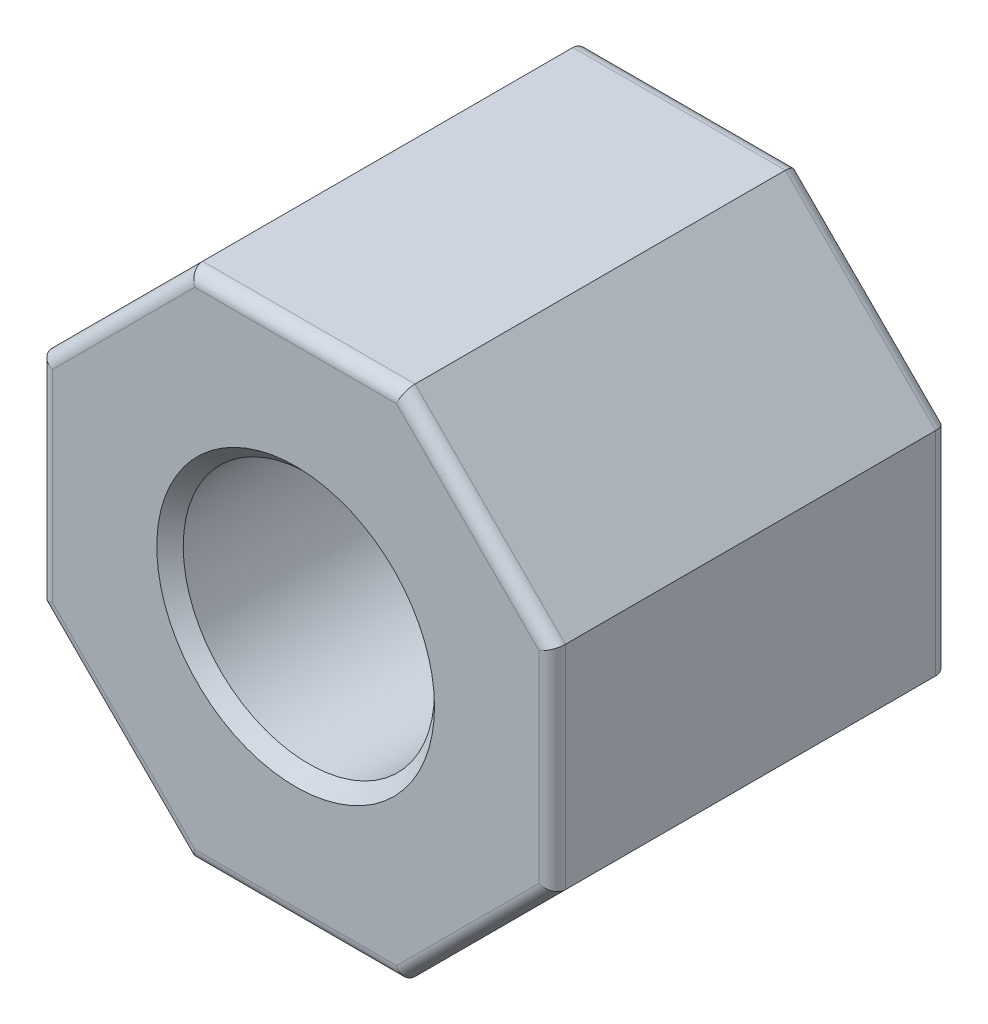
ISO-10303-21;
HEADER;
FILE_DESCRIPTION(('STEP AP214'),'2;1');
FILE_NAME('part.step','',(''),(''),'','','');
FILE_SCHEMA(('AUTOMOTIVE_DESIGN { 1 0 10303 214 1 1 1 1 }'));
ENDSEC;
DATA;
#1=APPLICATION_CONTEXT('core data for automotive mechanical design processes');
#2=APPLICATION_PROTOCOL_DEFINITION('international standard','automotive_design',2000,#1);
#3=PRODUCT_CONTEXT('',#1,'mechanical');
#4=PRODUCT('Part','Part','',(#3));
#5=PRODUCT_RELATED_PRODUCT_CATEGORY('part','',(#4));
#6=PRODUCT_DEFINITION_FORMATION('','',#4);
#7=PRODUCT_DEFINITION_CONTEXT('part definition',#1,'design');
#8=PRODUCT_DEFINITION('design','',#6,#7);
#9=PRODUCT_DEFINITION_SHAPE('','',#8);
#10=(LENGTH_UNIT() NAMED_UNIT(*) SI_UNIT(.MILLI.,.METRE.));
#11=(NAMED_UNIT(*) PLANE_ANGLE_UNIT() SI_UNIT($,.RADIAN.));
#12=(NAMED_UNIT(*) SI_UNIT($,.STERADIAN.) SOLID_ANGLE_UNIT());
#13=UNCERTAINTY_MEASURE_WITH_UNIT(LENGTH_MEASURE(1.E-05),#10,'distance_accuracy_value','');
#14=(GEOMETRIC_REPRESENTATION_CONTEXT(3) GLOBAL_UNCERTAINTY_ASSIGNED_CONTEXT((#13)) GLOBAL_UNIT_ASSIGNED_CONTEXT((#10,
#11,#12)) REPRESENTATION_CONTEXT('',''));
#15=CARTESIAN_POINT('',(0.,0.,0.));
#16=DIRECTION('',(0.,0.,1.));
#17=DIRECTION('',(1.,0.,0.));
#18=AXIS2_PLACEMENT_3D('',#15,#16,#17);
#19=CARTESIAN_POINT('',(0.,19.401470182737,30.));
#20=DIRECTION('',(0.,-1.,0.));
#21=DIRECTION('',(0.,0.,-1.));
#22=AXIS2_PLACEMENT_3D('',#19,#20,#21);
#23=PLANE('',#22);
#24=DIRECTION('',(0.,0.,-1.));
#25=VECTOR('',#24,1.);
#26=CARTESIAN_POINT('',(-8.03635207966684,19.401470182737,30.));
#27=LINE('',#26,#25);
#28=CARTESIAN_POINT('',(-8.03635207966684,19.401470182737,29.));
#29=VERTEX_POINT('',#28);
#30=CARTESIAN_POINT('',(-8.03635207966684,19.401470182737,1.));
#31=VERTEX_POINT('',#30);
#32=EDGE_CURVE('E396',#29,#31,#27,.T.);
#33=ORIENTED_EDGE('',*,*,#32,.F.);
#34=DIRECTION('',(-1.,0.,0.));
#35=VECTOR('',#34,1.);
#36=CARTESIAN_POINT('',(8.03635207966683,19.401470182737,29.));
#37=LINE('',#36,#35);
#38=CARTESIAN_POINT('',(8.03635207966683,19.401470182737,29.));
#39=VERTEX_POINT('',#38);
#40=EDGE_CURVE('E171',#29,#39,#37,.F.);
#41=ORIENTED_EDGE('',*,*,#40,.T.);
#42=DIRECTION('',(0.,0.,-1.));
#43=VECTOR('',#42,1.);
#44=CARTESIAN_POINT('',(8.03635207966683,19.401470182737,30.));
#45=LINE('',#44,#43);
#46=CARTESIAN_POINT('',(8.03635207966683,19.401470182737,1.));
#47=VERTEX_POINT('',#46);
#48=EDGE_CURVE('E175',#39,#47,#45,.T.);
#49=ORIENTED_EDGE('',*,*,#48,.T.);
#50=DIRECTION('',(-1.,0.,0.));
#51=VECTOR('',#50,1.);
#52=CARTESIAN_POINT('',(0.,19.401470182737,1.));
#53=LINE('',#52,#51);
#54=EDGE_CURVE('E247',#47,#31,#53,.T.);
#55=ORIENTED_EDGE('',*,*,#54,.T.);
#56=EDGE_LOOP('',(#33,#41,#49,#55));
#57=FACE_BOUND('',#56,.T.);
#58=ADVANCED_FACE('F42',(#57),#23,.F.);
#59=CARTESIAN_POINT('',(-13.7189111312019,13.718911131202,30.));
#60=DIRECTION('',(0.707106781186546,-0.707106781186549,0.));
#61=DIRECTION('',(0.707106781186549,0.707106781186546,0.));
#62=AXIS2_PLACEMENT_3D('',#59,#60,#61);
#63=PLANE('',#62);
#64=DIRECTION('',(0.,0.,-1.));
#65=VECTOR('',#64,1.);
#66=CARTESIAN_POINT('',(-19.401470182737,8.03635207966691,30.));
#67=LINE('',#66,#65);
#68=CARTESIAN_POINT('',(-19.401470182737,8.03635207966691,29.));
#69=VERTEX_POINT('',#68);
#70=CARTESIAN_POINT('',(-19.401470182737,8.03635207966691,1.));
#71=VERTEX_POINT('',#70);
#72=EDGE_CURVE('E392',#69,#71,#67,.T.);
#73=ORIENTED_EDGE('',*,*,#72,.F.);
#74=DIRECTION('',(-0.707106781186549,-0.707106781186546,0.));
#75=VECTOR('',#74,1.);
#76=CARTESIAN_POINT('',(-8.03635207966683,19.401470182737,29.));
#77=LINE('',#76,#75);
#78=EDGE_CURVE('E255',#69,#29,#77,.F.);
#79=ORIENTED_EDGE('',*,*,#78,.T.);
#80=ORIENTED_EDGE('',*,*,#32,.T.);
#81=DIRECTION('',(-0.707106781186549,-0.707106781186546,0.));
#82=VECTOR('',#81,1.);
#83=CARTESIAN_POINT('',(-13.7189111312019,13.718911131202,1.));
#84=LINE('',#83,#82);
#85=EDGE_CURVE('E252',#31,#71,#84,.T.);
#86=ORIENTED_EDGE('',*,*,#85,.T.);
#87=EDGE_LOOP('',(#73,#79,#80,#86));
#88=FACE_BOUND('',#87,.T.);
#89=ADVANCED_FACE('F433',(#88),#63,.F.);
#90=CARTESIAN_POINT('',(-19.401470182737,0.,30.));
#91=DIRECTION('',(1.,0.,0.));
#92=DIRECTION('',(0.,0.,-1.));
#93=AXIS2_PLACEMENT_3D('',#90,#91,#92);
#94=PLANE('',#93);
#95=DIRECTION('',(0.,0.,-1.));
#96=VECTOR('',#95,1.);
#97=CARTESIAN_POINT('',(-19.401470182737,-8.03635207966691,30.));
#98=LINE('',#97,#96);
#99=CARTESIAN_POINT('',(-19.401470182737,-8.03635207966691,29.));
#100=VERTEX_POINT('',#99);
#101=CARTESIAN_POINT('',(-19.401470182737,-8.03635207966691,1.));
#102=VERTEX_POINT('',#101);
#103=EDGE_CURVE('E383',#100,#102,#98,.T.);
#104=ORIENTED_EDGE('',*,*,#103,.F.);
#105=DIRECTION('',(0.,-1.,0.));
#106=VECTOR('',#105,1.);
#107=CARTESIAN_POINT('',(-19.401470182737,8.03635207966691,29.));
#108=LINE('',#107,#106);
#109=EDGE_CURVE('E225',#100,#69,#108,.F.);
#110=ORIENTED_EDGE('',*,*,#109,.T.);
#111=ORIENTED_EDGE('',*,*,#72,.T.);
#112=DIRECTION('',(0.,-1.,0.));
#113=VECTOR('',#112,1.);
#114=CARTESIAN_POINT('',(-19.401470182737,0.,1.));
#115=LINE('',#114,#113);
#116=EDGE_CURVE('E222',#71,#102,#115,.T.);
#117=ORIENTED_EDGE('',*,*,#116,.T.);
#118=EDGE_LOOP('',(#104,#110,#111,#117));
#119=FACE_BOUND('',#118,.T.);
#120=ADVANCED_FACE('F439',(#119),#94,.F.);
#121=CARTESIAN_POINT('',(-13.718911131202,-13.718911131202,30.));
#122=DIRECTION('',(0.707106781186549,0.707106781186547,0.));
#123=DIRECTION('',(-0.707106781186547,0.707106781186549,0.));
#124=AXIS2_PLACEMENT_3D('',#121,#122,#123);
#125=PLANE('',#124);
#126=DIRECTION('',(0.,0.,-1.));
#127=VECTOR('',#126,1.);
#128=CARTESIAN_POINT('',(-8.03635207966687,-19.4014701827371,30.));
#129=LINE('',#128,#127);
#130=CARTESIAN_POINT('',(-8.03635207966687,-19.4014701827371,29.));
#131=VERTEX_POINT('',#130);
#132=CARTESIAN_POINT('',(-8.03635207966687,-19.4014701827371,1.));
#133=VERTEX_POINT('',#132);
#134=EDGE_CURVE('E372',#131,#133,#129,.T.);
#135=ORIENTED_EDGE('',*,*,#134,.F.);
#136=DIRECTION('',(0.707106781186547,-0.707106781186549,0.));
#137=VECTOR('',#136,1.);
#138=CARTESIAN_POINT('',(-19.401470182737,-8.03635207966691,29.));
#139=LINE('',#138,#137);
#140=EDGE_CURVE('E219',#131,#100,#139,.F.);
#141=ORIENTED_EDGE('',*,*,#140,.T.);
#142=ORIENTED_EDGE('',*,*,#103,.T.);
#143=DIRECTION('',(0.707106781186547,-0.707106781186549,0.));
#144=VECTOR('',#143,1.);
#145=CARTESIAN_POINT('',(-13.718911131202,-13.718911131202,1.));
#146=LINE('',#145,#144);
#147=EDGE_CURVE('E216',#102,#133,#146,.T.);
#148=ORIENTED_EDGE('',*,*,#147,.T.);
#149=EDGE_LOOP('',(#135,#141,#142,#148));
#150=FACE_BOUND('',#149,.T.);
#151=ADVANCED_FACE('F584',(#150),#125,.F.);
#152=CARTESIAN_POINT('',(0.,-19.4014701827371,30.));
#153=DIRECTION('',(0.,1.,0.));
#154=DIRECTION('',(-1.,0.,0.));
#155=AXIS2_PLACEMENT_3D('',#152,#153,#154);
#156=PLANE('',#155);
#157=DIRECTION('',(0.,0.,-1.));
#158=VECTOR('',#157,1.);
#159=CARTESIAN_POINT('',(8.03635207966695,-19.4014701827371,30.));
#160=LINE('',#159,#158);
#161=CARTESIAN_POINT('',(8.03635207966695,-19.4014701827371,29.));
#162=VERTEX_POINT('',#161);
#163=CARTESIAN_POINT('',(8.03635207966695,-19.4014701827371,1.));
#164=VERTEX_POINT('',#163);
#165=EDGE_CURVE('E369',#162,#164,#160,.T.);
#166=ORIENTED_EDGE('',*,*,#165,.F.);
#167=DIRECTION('',(1.,0.,0.));
#168=VECTOR('',#167,1.);
#169=CARTESIAN_POINT('',(-8.03635207966687,-19.4014701827371,29.));
#170=LINE('',#169,#168);
#171=EDGE_CURVE('E212',#162,#131,#170,.F.);
#172=ORIENTED_EDGE('',*,*,#171,.T.);
#173=ORIENTED_EDGE('',*,*,#134,.T.);
#174=DIRECTION('',(1.,0.,0.));
#175=VECTOR('',#174,1.);
#176=CARTESIAN_POINT('',(0.,-19.4014701827371,1.));
#177=LINE('',#176,#175);
#178=EDGE_CURVE('E209',#133,#164,#177,.T.);
#179=ORIENTED_EDGE('',*,*,#178,.T.);
#180=EDGE_LOOP('',(#166,#172,#173,#179));
#181=FACE_BOUND('',#180,.T.);
#182=ADVANCED_FACE('F368',(#181),#156,.F.);
#183=CARTESIAN_POINT('',(13.718911131202,-13.718911131202,30.));
#184=DIRECTION('',(-0.707106781186549,0.707106781186546,0.));
#185=DIRECTION('',(-0.707106781186546,-0.707106781186549,0.));
#186=AXIS2_PLACEMENT_3D('',#183,#184,#185);
#187=PLANE('',#186);
#188=DIRECTION('',(0.,0.,-1.));
#189=VECTOR('',#188,1.);
#190=CARTESIAN_POINT('',(19.4014701827371,-8.03635207966686,30.));
#191=LINE('',#190,#189);
#192=CARTESIAN_POINT('',(19.4014701827371,-8.03635207966686,29.));
#193=VERTEX_POINT('',#192);
#194=CARTESIAN_POINT('',(19.4014701827371,-8.03635207966686,1.));
#195=VERTEX_POINT('',#194);
#196=EDGE_CURVE('E379',#193,#195,#191,.T.);
#197=ORIENTED_EDGE('',*,*,#196,.F.);
#198=DIRECTION('',(0.707106781186546,0.707106781186549,0.));
#199=VECTOR('',#198,1.);
#200=CARTESIAN_POINT('',(8.03635207966695,-19.4014701827371,29.));
#201=LINE('',#200,#199);
#202=EDGE_CURVE('E231',#193,#162,#201,.F.);
#203=ORIENTED_EDGE('',*,*,#202,.T.);
#204=ORIENTED_EDGE('',*,*,#165,.T.);
#205=DIRECTION('',(0.707106781186546,0.707106781186549,0.));
#206=VECTOR('',#205,1.);
#207=CARTESIAN_POINT('',(13.718911131202,-13.718911131202,1.));
#208=LINE('',#207,#206);
#209=EDGE_CURVE('E228',#164,#195,#208,.T.);
#210=ORIENTED_EDGE('',*,*,#209,.T.);
#211=EDGE_LOOP('',(#197,#203,#204,#210));
#212=FACE_BOUND('',#211,.T.);
#213=ADVANCED_FACE('F375',(#212),#187,.F.);
#214=CARTESIAN_POINT('',(19.4014701827371,0.,30.));
#215=DIRECTION('',(-1.,0.,0.));
#216=DIRECTION('',(0.,-1.,0.));
#217=AXIS2_PLACEMENT_3D('',#214,#215,#216);
#218=PLANE('',#217);
#219=DIRECTION('',(0.,0.,-1.));
#220=VECTOR('',#219,1.);
#221=CARTESIAN_POINT('',(19.4014701827371,8.03635207966695,30.));
#222=LINE('',#221,#220);
#223=CARTESIAN_POINT('',(19.4014701827371,8.03635207966695,29.));
#224=VERTEX_POINT('',#223);
#225=CARTESIAN_POINT('',(19.4014701827371,8.03635207966695,1.));
#226=VERTEX_POINT('',#225);
#227=EDGE_CURVE('E385',#224,#226,#222,.T.);
#228=ORIENTED_EDGE('',*,*,#227,.F.);
#229=DIRECTION('',(0.,1.,0.));
#230=VECTOR('',#229,1.);
#231=CARTESIAN_POINT('',(19.4014701827371,-8.03635207966686,29.));
#232=LINE('',#231,#230);
#233=EDGE_CURVE('E238',#224,#193,#232,.F.);
#234=ORIENTED_EDGE('',*,*,#233,.T.);
#235=ORIENTED_EDGE('',*,*,#196,.T.);
#236=DIRECTION('',(0.,1.,0.));
#237=VECTOR('',#236,1.);
#238=CARTESIAN_POINT('',(19.4014701827371,0.,1.));
#239=LINE('',#238,#237);
#240=EDGE_CURVE('E234',#195,#226,#239,.T.);
#241=ORIENTED_EDGE('',*,*,#240,.T.);
#242=EDGE_LOOP('',(#228,#234,#235,#241));
#243=FACE_BOUND('',#242,.T.);
#244=ADVANCED_FACE('F428',(#243),#218,.F.);
#245=CARTESIAN_POINT('',(13.7189111312019,13.7189111312021,30.));
#246=DIRECTION('',(-0.707106781186543,-0.707106781186552,0.));
#247=DIRECTION('',(0.707106781186552,-0.707106781186543,0.));
#248=AXIS2_PLACEMENT_3D('',#245,#246,#247);
#249=PLANE('',#248);
#250=ORIENTED_EDGE('',*,*,#48,.F.);
#251=DIRECTION('',(-0.707106781186552,0.707106781186543,0.));
#252=VECTOR('',#251,1.);
#253=CARTESIAN_POINT('',(19.4014701827371,8.03635207966695,29.));
#254=LINE('',#253,#252);
#255=EDGE_CURVE('E244',#39,#224,#254,.F.);
#256=ORIENTED_EDGE('',*,*,#255,.T.);
#257=ORIENTED_EDGE('',*,*,#227,.T.);
#258=DIRECTION('',(-0.707106781186552,0.707106781186543,0.));
#259=VECTOR('',#258,1.);
#260=CARTESIAN_POINT('',(13.7189111312019,13.7189111312021,1.));
#261=LINE('',#260,#259);
#262=EDGE_CURVE('E241',#226,#47,#261,.T.);
#263=ORIENTED_EDGE('',*,*,#262,.T.);
#264=EDGE_LOOP('',(#250,#256,#257,#263));
#265=FACE_BOUND('',#264,.T.);
#266=ADVANCED_FACE('F421',(#265),#249,.F.);
#267=CARTESIAN_POINT('',(0.,0.,30.));
#268=DIRECTION('',(0.,0.,1.));
#269=DIRECTION('',(1.,0.,0.));
#270=AXIS2_PLACEMENT_3D('',#267,#268,#269);
#271=PLANE('',#270);
#272=DIRECTION('',(0.707106781186547,-0.707106781186549,0.));
#273=VECTOR('',#272,1.);
#274=CARTESIAN_POINT('',(-7.32924529848032,-18.6943634015505,30.));
#275=LINE('',#274,#273);
#276=CARTESIAN_POINT('',(-18.401470182737,-7.62213851729382,30.));
#277=VERTEX_POINT('',#276);
#278=CARTESIAN_POINT('',(-7.62213851729378,-18.4014701827371,30.));
#279=VERTEX_POINT('',#278);
#280=EDGE_CURVE('E202',#277,#279,#275,.T.);
#281=ORIENTED_EDGE('',*,*,#280,.T.);
#282=DIRECTION('',(1.,0.,0.));
#283=VECTOR('',#282,1.);
#284=CARTESIAN_POINT('',(8.03635207966695,-18.4014701827371,30.));
#285=LINE('',#284,#283);
#286=CARTESIAN_POINT('',(7.62213851729385,-18.4014701827371,30.));
#287=VERTEX_POINT('',#286);
#288=EDGE_CURVE('E205',#279,#287,#285,.T.);
#289=ORIENTED_EDGE('',*,*,#288,.T.);
#290=DIRECTION('',(0.707106781186546,0.707106781186549,0.));
#291=VECTOR('',#290,1.);
#292=CARTESIAN_POINT('',(18.6943634015506,-7.32924529848032,30.));
#293=LINE('',#292,#291);
#294=CARTESIAN_POINT('',(18.4014701827371,-7.62213851729376,30.));
#295=VERTEX_POINT('',#294);
#296=EDGE_CURVE('E196',#287,#295,#293,.T.);
#297=ORIENTED_EDGE('',*,*,#296,.T.);
#298=DIRECTION('',(0.,1.,0.));
#299=VECTOR('',#298,1.);
#300=CARTESIAN_POINT('',(18.4014701827371,8.03635207966695,30.));
#301=LINE('',#300,#299);
#302=CARTESIAN_POINT('',(18.4014701827371,7.62213851729384,30.));
#303=VERTEX_POINT('',#302);
#304=EDGE_CURVE('E193',#295,#303,#301,.T.);
#305=ORIENTED_EDGE('',*,*,#304,.T.);
#306=DIRECTION('',(-0.707106781186552,0.707106781186543,0.));
#307=VECTOR('',#306,1.);
#308=CARTESIAN_POINT('',(7.32924529848028,18.6943634015505,30.));
#309=LINE('',#308,#307);
#310=CARTESIAN_POINT('',(7.62213851729374,18.401470182737,30.));
#311=VERTEX_POINT('',#310);
#312=EDGE_CURVE('E161',#303,#311,#309,.T.);
#313=ORIENTED_EDGE('',*,*,#312,.T.);
#314=DIRECTION('',(-1.,0.,0.));
#315=VECTOR('',#314,1.);
#316=CARTESIAN_POINT('',(-8.03635207966684,18.401470182737,30.));
#317=LINE('',#316,#315);
#318=CARTESIAN_POINT('',(-7.62213851729374,18.401470182737,30.));
#319=VERTEX_POINT('',#318);
#320=EDGE_CURVE('E153',#311,#319,#317,.T.);
#321=ORIENTED_EDGE('',*,*,#320,.T.);
#322=DIRECTION('',(-0.707106781186549,-0.707106781186546,0.));
#323=VECTOR('',#322,1.);
#324=CARTESIAN_POINT('',(-18.6943634015505,7.32924529848035,30.));
#325=LINE('',#324,#323);
#326=CARTESIAN_POINT('',(-18.401470182737,7.62213851729381,30.));
#327=VERTEX_POINT('',#326);
#328=EDGE_CURVE('E158',#319,#327,#325,.T.);
#329=ORIENTED_EDGE('',*,*,#328,.T.);
#330=DIRECTION('',(0.,-1.,0.));
#331=VECTOR('',#330,1.);
#332=CARTESIAN_POINT('',(-18.401470182737,-8.03635207966691,30.));
#333=LINE('',#332,#331);
#334=EDGE_CURVE('E199',#327,#277,#333,.T.);
#335=ORIENTED_EDGE('',*,*,#334,.T.);
#336=EDGE_LOOP('',(#281,#289,#297,#305,#313,#321,#329,#335));
#337=FACE_BOUND('',#336,.T.);
#338=CARTESIAN_POINT('',(0.,0.,30.));
#339=DIRECTION('',(0.,0.,1.));
#340=DIRECTION('',(1.,0.,0.));
#341=AXIS2_PLACEMENT_3D('',#338,#339,#340);
#342=CIRCLE('',#341,10.5);
#343=CARTESIAN_POINT('',(10.5,0.,30.));
#344=VERTEX_POINT('',#343);
#345=EDGE_CURVE('E400',#344,#344,#342,.F.);
#346=ORIENTED_EDGE('',*,*,#345,.T.);
#347=EDGE_LOOP('',(#346));
#348=FACE_BOUND('',#347,.T.);
#349=ADVANCED_FACE('F155',(#337,#348),#271,.T.);
#350=CARTESIAN_POINT('',(0.,0.,0.));
#351=DIRECTION('',(0.,0.,1.));
#352=DIRECTION('',(1.,0.,0.));
#353=AXIS2_PLACEMENT_3D('',#350,#351,#352);
#354=PLANE('',#353);
#355=DIRECTION('',(0.,1.,0.));
#356=VECTOR('',#355,1.);
#357=CARTESIAN_POINT('',(18.4014701827371,0.,0.));
#358=LINE('',#357,#356);
#359=CARTESIAN_POINT('',(18.4014701827371,7.62213851729384,0.));
#360=VERTEX_POINT('',#359);
#361=CARTESIAN_POINT('',(18.4014701827371,-7.62213851729376,0.));
#362=VERTEX_POINT('',#361);
#363=EDGE_CURVE('E264',#360,#362,#358,.F.);
#364=ORIENTED_EDGE('',*,*,#363,.T.);
#365=DIRECTION('',(0.707106781186546,0.707106781186549,0.));
#366=VECTOR('',#365,1.);
#367=CARTESIAN_POINT('',(13.0118043500155,-13.0118043500154,0.));
#368=LINE('',#367,#366);
#369=CARTESIAN_POINT('',(7.62213851729385,-18.4014701827371,0.));
#370=VERTEX_POINT('',#369);
#371=EDGE_CURVE('E11',#362,#370,#368,.F.);
#372=ORIENTED_EDGE('',*,*,#371,.T.);
#373=DIRECTION('',(1.,0.,0.));
#374=VECTOR('',#373,1.);
#375=CARTESIAN_POINT('',(0.,-18.4014701827371,0.));
#376=LINE('',#375,#374);
#377=CARTESIAN_POINT('',(-7.62213851729377,-18.4014701827371,0.));
#378=VERTEX_POINT('',#377);
#379=EDGE_CURVE('E52',#370,#378,#376,.F.);
#380=ORIENTED_EDGE('',*,*,#379,.T.);
#381=DIRECTION('',(0.707106781186547,-0.707106781186549,0.));
#382=VECTOR('',#381,1.);
#383=CARTESIAN_POINT('',(-13.0118043500154,-13.0118043500154,0.));
#384=LINE('',#383,#382);
#385=CARTESIAN_POINT('',(-18.401470182737,-7.62213851729382,0.));
#386=VERTEX_POINT('',#385);
#387=EDGE_CURVE('E273',#378,#386,#384,.F.);
#388=ORIENTED_EDGE('',*,*,#387,.T.);
#389=DIRECTION('',(0.,-1.,0.));
#390=VECTOR('',#389,1.);
#391=CARTESIAN_POINT('',(-18.401470182737,0.,0.));
#392=LINE('',#391,#390);
#393=CARTESIAN_POINT('',(-18.401470182737,7.62213851729381,0.));
#394=VERTEX_POINT('',#393);
#395=EDGE_CURVE('E270',#386,#394,#392,.F.);
#396=ORIENTED_EDGE('',*,*,#395,.T.);
#397=DIRECTION('',(-0.707106781186549,-0.707106781186546,0.));
#398=VECTOR('',#397,1.);
#399=CARTESIAN_POINT('',(-13.0118043500154,13.0118043500154,0.));
#400=LINE('',#399,#398);
#401=CARTESIAN_POINT('',(-7.62213851729374,18.401470182737,0.));
#402=VERTEX_POINT('',#401);
#403=EDGE_CURVE('E267',#394,#402,#400,.F.);
#404=ORIENTED_EDGE('',*,*,#403,.T.);
#405=DIRECTION('',(-1.,0.,0.));
#406=VECTOR('',#405,1.);
#407=CARTESIAN_POINT('',(0.,18.401470182737,0.));
#408=LINE('',#407,#406);
#409=CARTESIAN_POINT('',(7.62213851729374,18.401470182737,0.));
#410=VERTEX_POINT('',#409);
#411=EDGE_CURVE('E261',#402,#410,#408,.F.);
#412=ORIENTED_EDGE('',*,*,#411,.T.);
#413=DIRECTION('',(-0.707106781186552,0.707106781186543,0.));
#414=VECTOR('',#413,1.);
#415=CARTESIAN_POINT('',(13.0118043500153,13.0118043500155,0.));
#416=LINE('',#415,#414);
#417=EDGE_CURVE('E258',#410,#360,#416,.F.);
#418=ORIENTED_EDGE('',*,*,#417,.T.);
#419=EDGE_LOOP('',(#364,#372,#380,#388,#396,#404,#412,#418));
#420=FACE_BOUND('',#419,.T.);
#421=CARTESIAN_POINT('',(0.,0.,0.));
#422=DIRECTION('',(0.,0.,1.));
#423=DIRECTION('',(1.,0.,0.));
#424=AXIS2_PLACEMENT_3D('',#421,#422,#423);
#425=CIRCLE('',#424,10.5);
#426=CARTESIAN_POINT('',(10.5,0.,0.));
#427=VERTEX_POINT('',#426);
#428=EDGE_CURVE('E183',#427,#427,#425,.T.);
#429=ORIENTED_EDGE('',*,*,#428,.T.);
#430=EDGE_LOOP('',(#429));
#431=FACE_BOUND('',#430,.T.);
#432=ADVANCED_FACE('F338',(#420,#431),#354,.F.);
#433=CARTESIAN_POINT('',(0.,0.,30.));
#434=DIRECTION('',(0.,0.,-1.));
#435=DIRECTION('',(-1.,0.,0.));
#436=AXIS2_PLACEMENT_3D('',#433,#434,#435);
#437=CYLINDRICAL_SURFACE('',#436,9.5);
#438=CARTESIAN_POINT('',(0.,0.,29.));
#439=DIRECTION('',(0.,0.,1.));
#440=DIRECTION('',(1.,0.,0.));
#441=AXIS2_PLACEMENT_3D('',#438,#439,#440);
#442=CIRCLE('',#441,9.5);
#443=CARTESIAN_POINT('',(9.5,0.,29.));
#444=VERTEX_POINT('',#443);
#445=EDGE_CURVE('E187',#444,#444,#442,.T.);
#446=ORIENTED_EDGE('',*,*,#445,.T.);
#447=EDGE_LOOP('',(#446));
#448=FACE_BOUND('',#447,.T.);
#449=CARTESIAN_POINT('',(0.,0.,0.999999999999994));
#450=DIRECTION('',(0.,0.,1.));
#451=DIRECTION('',(1.,0.,0.));
#452=AXIS2_PLACEMENT_3D('',#449,#450,#451);
#453=CIRCLE('',#452,9.5);
#454=CARTESIAN_POINT('',(9.5,0.,0.999999999999994));
#455=VERTEX_POINT('',#454);
#456=EDGE_CURVE('E404',#455,#455,#453,.F.);
#457=ORIENTED_EDGE('',*,*,#456,.T.);
#458=EDGE_LOOP('',(#457));
#459=FACE_BOUND('',#458,.T.);
#460=ADVANCED_FACE('F411',(#448,#459),#437,.F.);
#461=CARTESIAN_POINT('',(0.,0.,30.));
#462=DIRECTION('',(0.,0.,1.));
#463=DIRECTION('',(1.,0.,0.));
#464=AXIS2_PLACEMENT_3D('',#461,#462,#463);
#465=CONICAL_SURFACE('',#464,10.5,0.785398163397447);
#466=ORIENTED_EDGE('',*,*,#445,.F.);
#467=EDGE_LOOP('',(#466));
#468=FACE_BOUND('',#467,.T.);
#469=ORIENTED_EDGE('',*,*,#345,.F.);
#470=EDGE_LOOP('',(#469));
#471=FACE_BOUND('',#470,.T.);
#472=ADVANCED_FACE('F414',(#468,#471),#465,.F.);
#473=CARTESIAN_POINT('',(0.,0.,0.999999999999994));
#474=DIRECTION('',(0.,0.,-1.));
#475=DIRECTION('',(-1.,0.,0.));
#476=AXIS2_PLACEMENT_3D('',#473,#474,#475);
#477=CONICAL_SURFACE('',#476,9.5,0.785398163397453);
#478=ORIENTED_EDGE('',*,*,#428,.F.);
#479=EDGE_LOOP('',(#478));
#480=FACE_BOUND('',#479,.T.);
#481=ORIENTED_EDGE('',*,*,#456,.F.);
#482=EDGE_LOOP('',(#481));
#483=FACE_BOUND('',#482,.T.);
#484=ADVANCED_FACE('F417',(#480,#483),#477,.F.);
#485=CARTESIAN_POINT('',(0.,18.401470182737,29.));
#486=DIRECTION('',(1.,0.,0.));
#487=DIRECTION('',(0.,0.,-1.));
#488=AXIS2_PLACEMENT_3D('',#485,#486,#487);
#489=CYLINDRICAL_SURFACE('',#488,1.);
#490=CARTESIAN_POINT('',(7.62213851729373,18.401470182737,29.));
#491=DIRECTION('',(0.923879532511288,-0.382683432365087,0.));
#492=DIRECTION('',(0.382683432365087,0.923879532511288,0.));
#493=AXIS2_PLACEMENT_3D('',#490,#491,#492);
#494=ELLIPSE('',#493,1.08239220029239,1.);
#495=EDGE_CURVE('E176',#39,#311,#494,.T.);
#496=ORIENTED_EDGE('',*,*,#495,.F.);
#497=ORIENTED_EDGE('',*,*,#40,.F.);
#498=CARTESIAN_POINT('',(-7.62213851729374,18.401470182737,29.));
#499=DIRECTION('',(0.923879532511287,0.382683432365089,0.));
#500=DIRECTION('',(-0.382683432365089,0.923879532511287,0.));
#501=AXIS2_PLACEMENT_3D('',#498,#499,#500);
#502=ELLIPSE('',#501,1.08239220029239,1.);
#503=EDGE_CURVE('E169',#319,#29,#502,.F.);
#504=ORIENTED_EDGE('',*,*,#503,.F.);
#505=ORIENTED_EDGE('',*,*,#320,.F.);
#506=EDGE_LOOP('',(#496,#497,#504,#505));
#507=FACE_BOUND('',#506,.T.);
#508=ADVANCED_FACE('F170',(#507),#489,.T.);
#509=CARTESIAN_POINT('',(-13.0118043500154,13.0118043500154,29.));
#510=DIRECTION('',(0.707106781186549,0.707106781186546,0.));
#511=DIRECTION('',(-0.707106781186546,0.707106781186549,0.));
#512=AXIS2_PLACEMENT_3D('',#509,#510,#511);
#513=CYLINDRICAL_SURFACE('',#512,1.);
#514=ORIENTED_EDGE('',*,*,#503,.T.);
#515=ORIENTED_EDGE('',*,*,#78,.F.);
#516=CARTESIAN_POINT('',(-18.401470182737,7.62213851729381,29.));
#517=DIRECTION('',(0.382683432365091,0.923879532511287,0.));
#518=DIRECTION('',(0.923879532511286,-0.38268343236509,0.));
#519=AXIS2_PLACEMENT_3D('',#516,#517,#518);
#520=ELLIPSE('',#519,1.08239220029239,1.);
#521=EDGE_CURVE('E180',#327,#69,#520,.F.);
#522=ORIENTED_EDGE('',*,*,#521,.F.);
#523=ORIENTED_EDGE('',*,*,#328,.F.);
#524=EDGE_LOOP('',(#514,#515,#522,#523));
#525=FACE_BOUND('',#524,.T.);
#526=ADVANCED_FACE('F178',(#525),#513,.T.);
#527=CARTESIAN_POINT('',(13.0118043500153,13.0118043500155,29.));
#528=DIRECTION('',(0.707106781186552,-0.707106781186543,0.));
#529=DIRECTION('',(0.707106781186543,0.707106781186552,0.));
#530=AXIS2_PLACEMENT_3D('',#527,#528,#529);
#531=CYLINDRICAL_SURFACE('',#530,1.);
#532=ORIENTED_EDGE('',*,*,#495,.T.);
#533=ORIENTED_EDGE('',*,*,#312,.F.);
#534=CARTESIAN_POINT('',(18.4014701827371,7.62213851729384,29.));
#535=DIRECTION('',(0.382683432365094,-0.923879532511285,0.));
#536=DIRECTION('',(0.923879532511285,0.382683432365094,0.));
#537=AXIS2_PLACEMENT_3D('',#534,#535,#536);
#538=ELLIPSE('',#537,1.08239220029239,1.);
#539=EDGE_CURVE('E292',#224,#303,#538,.T.);
#540=ORIENTED_EDGE('',*,*,#539,.F.);
#541=ORIENTED_EDGE('',*,*,#255,.F.);
#542=EDGE_LOOP('',(#532,#533,#540,#541));
#543=FACE_BOUND('',#542,.T.);
#544=ADVANCED_FACE('F473',(#543),#531,.T.);
#545=CARTESIAN_POINT('',(-18.401470182737,0.,29.));
#546=DIRECTION('',(0.,1.,0.));
#547=DIRECTION('',(0.,0.,1.));
#548=AXIS2_PLACEMENT_3D('',#545,#546,#547);
#549=CYLINDRICAL_SURFACE('',#548,1.);
#550=ORIENTED_EDGE('',*,*,#521,.T.);
#551=ORIENTED_EDGE('',*,*,#109,.F.);
#552=CARTESIAN_POINT('',(-18.401470182737,-7.62213851729382,29.));
#553=DIRECTION('',(-0.382683432365089,0.923879532511287,0.));
#554=DIRECTION('',(0.923879532511287,0.382683432365089,0.));
#555=AXIS2_PLACEMENT_3D('',#552,#553,#554);
#556=ELLIPSE('',#555,1.08239220029239,1.);
#557=EDGE_CURVE('E288',#277,#100,#556,.F.);
#558=ORIENTED_EDGE('',*,*,#557,.F.);
#559=ORIENTED_EDGE('',*,*,#334,.F.);
#560=EDGE_LOOP('',(#550,#551,#558,#559));
#561=FACE_BOUND('',#560,.T.);
#562=ADVANCED_FACE('F469',(#561),#549,.T.);
#563=CARTESIAN_POINT('',(18.4014701827371,0.,29.));
#564=DIRECTION('',(0.,-1.,0.));
#565=DIRECTION('',(1.,0.,0.));
#566=AXIS2_PLACEMENT_3D('',#563,#564,#565);
#567=CYLINDRICAL_SURFACE('',#566,1.);
#568=ORIENTED_EDGE('',*,*,#539,.T.);
#569=ORIENTED_EDGE('',*,*,#304,.F.);
#570=CARTESIAN_POINT('',(18.4014701827371,-7.62213851729377,29.));
#571=DIRECTION('',(-0.382683432365088,-0.923879532511288,0.));
#572=DIRECTION('',(0.923879532511288,-0.382683432365088,0.));
#573=AXIS2_PLACEMENT_3D('',#570,#571,#572);
#574=ELLIPSE('',#573,1.08239220029239,1.);
#575=EDGE_CURVE('E284',#193,#295,#574,.T.);
#576=ORIENTED_EDGE('',*,*,#575,.F.);
#577=ORIENTED_EDGE('',*,*,#233,.F.);
#578=EDGE_LOOP('',(#568,#569,#576,#577));
#579=FACE_BOUND('',#578,.T.);
#580=ADVANCED_FACE('F465',(#579),#567,.T.);
#581=CARTESIAN_POINT('',(-13.0118043500154,-13.0118043500154,29.));
#582=DIRECTION('',(-0.707106781186547,0.707106781186549,0.));
#583=DIRECTION('',(-0.707106781186549,-0.707106781186547,0.));
#584=AXIS2_PLACEMENT_3D('',#581,#582,#583);
#585=CYLINDRICAL_SURFACE('',#584,1.);
#586=ORIENTED_EDGE('',*,*,#557,.T.);
#587=ORIENTED_EDGE('',*,*,#140,.F.);
#588=CARTESIAN_POINT('',(-7.62213851729378,-18.4014701827371,29.));
#589=DIRECTION('',(-0.923879532511287,0.382683432365089,0.));
#590=DIRECTION('',(0.382683432365089,0.923879532511287,0.));
#591=AXIS2_PLACEMENT_3D('',#588,#589,#590);
#592=ELLIPSE('',#591,1.08239220029239,1.);
#593=EDGE_CURVE('E281',#279,#131,#592,.F.);
#594=ORIENTED_EDGE('',*,*,#593,.F.);
#595=ORIENTED_EDGE('',*,*,#280,.F.);
#596=EDGE_LOOP('',(#586,#587,#594,#595));
#597=FACE_BOUND('',#596,.T.);
#598=ADVANCED_FACE('F461',(#597),#585,.T.);
#599=CARTESIAN_POINT('',(13.0118043500155,-13.0118043500154,29.));
#600=DIRECTION('',(-0.707106781186546,-0.707106781186549,0.));
#601=DIRECTION('',(0.707106781186549,-0.707106781186546,0.));
#602=AXIS2_PLACEMENT_3D('',#599,#600,#601);
#603=CYLINDRICAL_SURFACE('',#602,1.);
#604=ORIENTED_EDGE('',*,*,#575,.T.);
#605=ORIENTED_EDGE('',*,*,#296,.F.);
#606=CARTESIAN_POINT('',(7.62213851729385,-18.4014701827371,29.));
#607=DIRECTION('',(-0.923879532511286,-0.382683432365091,0.));
#608=DIRECTION('',(0.382683432365091,-0.923879532511286,0.));
#609=AXIS2_PLACEMENT_3D('',#606,#607,#608);
#610=ELLIPSE('',#609,1.08239220029239,1.);
#611=EDGE_CURVE('E278',#162,#287,#610,.T.);
#612=ORIENTED_EDGE('',*,*,#611,.F.);
#613=ORIENTED_EDGE('',*,*,#202,.F.);
#614=EDGE_LOOP('',(#604,#605,#612,#613));
#615=FACE_BOUND('',#614,.T.);
#616=ADVANCED_FACE('F457',(#615),#603,.T.);
#617=CARTESIAN_POINT('',(0.,-18.4014701827371,29.));
#618=DIRECTION('',(-1.,0.,0.));
#619=DIRECTION('',(0.,-1.,0.));
#620=AXIS2_PLACEMENT_3D('',#617,#618,#619);
#621=CYLINDRICAL_SURFACE('',#620,1.);
#622=ORIENTED_EDGE('',*,*,#593,.T.);
#623=ORIENTED_EDGE('',*,*,#171,.F.);
#624=ORIENTED_EDGE('',*,*,#611,.T.);
#625=ORIENTED_EDGE('',*,*,#288,.F.);
#626=EDGE_LOOP('',(#622,#623,#624,#625));
#627=FACE_BOUND('',#626,.T.);
#628=ADVANCED_FACE('F454',(#627),#621,.T.);
#629=CARTESIAN_POINT('',(-18.401470182737,0.,1.));
#630=DIRECTION('',(0.,-1.,0.));
#631=DIRECTION('',(0.,0.,-1.));
#632=AXIS2_PLACEMENT_3D('',#629,#630,#631);
#633=CYLINDRICAL_SURFACE('',#632,1.);
#634=CARTESIAN_POINT('',(-18.401470182737,7.62213851729381,1.));
#635=DIRECTION('',(-0.382683432365091,-0.923879532511287,0.));
#636=DIRECTION('',(-0.923879532511286,0.38268343236509,0.));
#637=AXIS2_PLACEMENT_3D('',#634,#635,#636);
#638=ELLIPSE('',#637,1.08239220029239,1.);
#639=EDGE_CURVE('E321',#394,#71,#638,.F.);
#640=ORIENTED_EDGE('',*,*,#639,.F.);
#641=ORIENTED_EDGE('',*,*,#395,.F.);
#642=CARTESIAN_POINT('',(-18.401470182737,-7.62213851729382,1.));
#643=DIRECTION('',(0.382683432365089,-0.923879532511287,0.));
#644=DIRECTION('',(-0.923879532511287,-0.382683432365089,0.));
#645=AXIS2_PLACEMENT_3D('',#642,#643,#644);
#646=ELLIPSE('',#645,1.08239220029239,1.);
#647=EDGE_CURVE('E46',#102,#386,#646,.T.);
#648=ORIENTED_EDGE('',*,*,#647,.F.);
#649=ORIENTED_EDGE('',*,*,#116,.F.);
#650=EDGE_LOOP('',(#640,#641,#648,#649));
#651=FACE_BOUND('',#650,.T.);
#652=ADVANCED_FACE('F44',(#651),#633,.T.);
#653=CARTESIAN_POINT('',(-13.0118043500154,-13.0118043500154,1.));
#654=DIRECTION('',(0.707106781186547,-0.707106781186549,0.));
#655=DIRECTION('',(0.707106781186549,0.707106781186547,0.));
#656=AXIS2_PLACEMENT_3D('',#653,#654,#655);
#657=CYLINDRICAL_SURFACE('',#656,1.);
#658=ORIENTED_EDGE('',*,*,#647,.T.);
#659=ORIENTED_EDGE('',*,*,#387,.F.);
#660=CARTESIAN_POINT('',(-7.62213851729377,-18.4014701827371,1.));
#661=DIRECTION('',(0.923879532511287,-0.382683432365089,0.));
#662=DIRECTION('',(-0.382683432365089,-0.923879532511287,0.));
#663=AXIS2_PLACEMENT_3D('',#660,#661,#662);
#664=ELLIPSE('',#663,1.08239220029239,1.);
#665=EDGE_CURVE('E318',#133,#378,#664,.T.);
#666=ORIENTED_EDGE('',*,*,#665,.F.);
#667=ORIENTED_EDGE('',*,*,#147,.F.);
#668=EDGE_LOOP('',(#658,#659,#666,#667));
#669=FACE_BOUND('',#668,.T.);
#670=ADVANCED_FACE('F333',(#669),#657,.T.);
#671=CARTESIAN_POINT('',(-13.0118043500154,13.0118043500154,1.));
#672=DIRECTION('',(-0.707106781186549,-0.707106781186546,0.));
#673=DIRECTION('',(0.707106781186546,-0.707106781186549,0.));
#674=AXIS2_PLACEMENT_3D('',#671,#672,#673);
#675=CYLINDRICAL_SURFACE('',#674,1.);
#676=ORIENTED_EDGE('',*,*,#639,.T.);
#677=ORIENTED_EDGE('',*,*,#85,.F.);
#678=CARTESIAN_POINT('',(-7.62213851729374,18.401470182737,1.));
#679=DIRECTION('',(-0.923879532511287,-0.382683432365089,0.));
#680=DIRECTION('',(0.382683432365089,-0.923879532511287,0.));
#681=AXIS2_PLACEMENT_3D('',#678,#679,#680);
#682=ELLIPSE('',#681,1.08239220029239,1.);
#683=EDGE_CURVE('E314',#402,#31,#682,.F.);
#684=ORIENTED_EDGE('',*,*,#683,.F.);
#685=ORIENTED_EDGE('',*,*,#403,.F.);
#686=EDGE_LOOP('',(#676,#677,#684,#685));
#687=FACE_BOUND('',#686,.T.);
#688=ADVANCED_FACE('F343',(#687),#675,.T.);
#689=CARTESIAN_POINT('',(0.,-18.4014701827371,1.));
#690=DIRECTION('',(1.,0.,0.));
#691=DIRECTION('',(0.,1.,0.));
#692=AXIS2_PLACEMENT_3D('',#689,#690,#691);
#693=CYLINDRICAL_SURFACE('',#692,1.);
#694=ORIENTED_EDGE('',*,*,#665,.T.);
#695=ORIENTED_EDGE('',*,*,#379,.F.);
#696=CARTESIAN_POINT('',(7.62213851729385,-18.4014701827371,1.));
#697=DIRECTION('',(0.923879532511286,0.382683432365091,0.));
#698=DIRECTION('',(0.382683432365091,-0.923879532511286,0.));
#699=AXIS2_PLACEMENT_3D('',#696,#697,#698);
#700=ELLIPSE('',#699,1.08239220029239,1.);
#701=EDGE_CURVE('E310',#164,#370,#700,.T.);
#702=ORIENTED_EDGE('',*,*,#701,.F.);
#703=ORIENTED_EDGE('',*,*,#178,.F.);
#704=EDGE_LOOP('',(#694,#695,#702,#703));
#705=FACE_BOUND('',#704,.T.);
#706=ADVANCED_FACE('F363',(#705),#693,.T.);
#707=CARTESIAN_POINT('',(0.,18.401470182737,1.));
#708=DIRECTION('',(-1.,0.,0.));
#709=DIRECTION('',(0.,0.,1.));
#710=AXIS2_PLACEMENT_3D('',#707,#708,#709);
#711=CYLINDRICAL_SURFACE('',#710,1.);
#712=ORIENTED_EDGE('',*,*,#683,.T.);
#713=ORIENTED_EDGE('',*,*,#54,.F.);
#714=CARTESIAN_POINT('',(7.62213851729374,18.401470182737,1.));
#715=DIRECTION('',(-0.923879532511288,0.382683432365087,0.));
#716=DIRECTION('',(0.382683432365087,0.923879532511288,0.));
#717=AXIS2_PLACEMENT_3D('',#714,#715,#716);
#718=ELLIPSE('',#717,1.08239220029239,1.);
#719=EDGE_CURVE('E306',#410,#47,#718,.F.);
#720=ORIENTED_EDGE('',*,*,#719,.F.);
#721=ORIENTED_EDGE('',*,*,#411,.F.);
#722=EDGE_LOOP('',(#712,#713,#720,#721));
#723=FACE_BOUND('',#722,.T.);
#724=ADVANCED_FACE('F346',(#723),#711,.T.);
#725=CARTESIAN_POINT('',(13.0118043500155,-13.0118043500154,1.));
#726=DIRECTION('',(0.707106781186546,0.707106781186549,0.));
#727=DIRECTION('',(-0.707106781186549,0.707106781186546,0.));
#728=AXIS2_PLACEMENT_3D('',#725,#726,#727);
#729=CYLINDRICAL_SURFACE('',#728,1.);
#730=ORIENTED_EDGE('',*,*,#701,.T.);
#731=ORIENTED_EDGE('',*,*,#371,.F.);
#732=CARTESIAN_POINT('',(18.4014701827371,-7.62213851729377,1.));
#733=DIRECTION('',(0.382683432365088,0.923879532511288,0.));
#734=DIRECTION('',(0.923879532511288,-0.382683432365088,0.));
#735=AXIS2_PLACEMENT_3D('',#732,#733,#734);
#736=ELLIPSE('',#735,1.08239220029239,1.);
#737=EDGE_CURVE('E303',#195,#362,#736,.T.);
#738=ORIENTED_EDGE('',*,*,#737,.F.);
#739=ORIENTED_EDGE('',*,*,#209,.F.);
#740=EDGE_LOOP('',(#730,#731,#738,#739));
#741=FACE_BOUND('',#740,.T.);
#742=ADVANCED_FACE('F359',(#741),#729,.T.);
#743=CARTESIAN_POINT('',(13.0118043500153,13.0118043500155,1.));
#744=DIRECTION('',(-0.707106781186552,0.707106781186543,0.));
#745=DIRECTION('',(-0.707106781186543,-0.707106781186552,0.));
#746=AXIS2_PLACEMENT_3D('',#743,#744,#745);
#747=CYLINDRICAL_SURFACE('',#746,1.);
#748=ORIENTED_EDGE('',*,*,#719,.T.);
#749=ORIENTED_EDGE('',*,*,#262,.F.);
#750=CARTESIAN_POINT('',(18.4014701827371,7.62213851729385,1.));
#751=DIRECTION('',(-0.382683432365094,0.923879532511285,0.));
#752=DIRECTION('',(-0.923879532511285,-0.382683432365094,0.));
#753=AXIS2_PLACEMENT_3D('',#750,#751,#752);
#754=ELLIPSE('',#753,1.08239220029239,1.);
#755=EDGE_CURVE('E300',#360,#226,#754,.F.);
#756=ORIENTED_EDGE('',*,*,#755,.F.);
#757=ORIENTED_EDGE('',*,*,#417,.F.);
#758=EDGE_LOOP('',(#748,#749,#756,#757));
#759=FACE_BOUND('',#758,.T.);
#760=ADVANCED_FACE('F351',(#759),#747,.T.);
#761=CARTESIAN_POINT('',(18.4014701827371,0.,1.));
#762=DIRECTION('',(0.,1.,0.));
#763=DIRECTION('',(-1.,0.,0.));
#764=AXIS2_PLACEMENT_3D('',#761,#762,#763);
#765=CYLINDRICAL_SURFACE('',#764,1.);
#766=ORIENTED_EDGE('',*,*,#737,.T.);
#767=ORIENTED_EDGE('',*,*,#363,.F.);
#768=ORIENTED_EDGE('',*,*,#755,.T.);
#769=ORIENTED_EDGE('',*,*,#240,.F.);
#770=EDGE_LOOP('',(#766,#767,#768,#769));
#771=FACE_BOUND('',#770,.T.);
#772=ADVANCED_FACE('F354',(#771),#765,.T.);
#773=CLOSED_SHELL('',(#58,#89,#120,#151,#182,#213,#244,#266,#349,#432,#460,#472,#484,#508,#526,
#544,#562,#580,#598,#616,#628,#652,#670,#688,#706,#724,#742,#760,#772));
#774=MANIFOLD_SOLID_BREP('B2',#773);
#775=ADVANCED_BREP_SHAPE_REPRESENTATION('',(#18,#774),#14);
#776=SHAPE_DEFINITION_REPRESENTATION(#9,#775);
ENDSEC;
END-ISO-10303-21;
